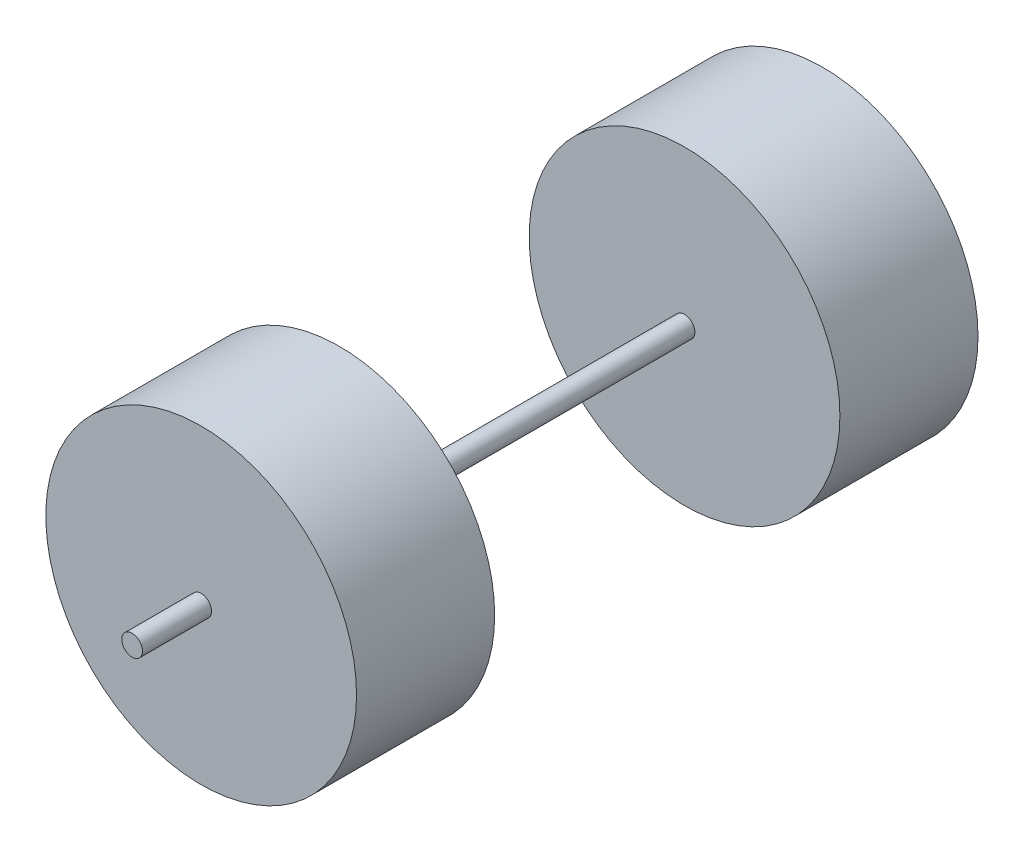
ISO-10303-21;
HEADER;
FILE_DESCRIPTION(('STEP AP214'),'2;1');
FILE_NAME('part.step','',(''),(''),'','','');
FILE_SCHEMA(('AUTOMOTIVE_DESIGN { 1 0 10303 214 1 1 1 1 }'));
ENDSEC;
DATA;
#1=APPLICATION_CONTEXT('core data for automotive mechanical design processes');
#2=APPLICATION_PROTOCOL_DEFINITION('international standard','automotive_design',2000,#1);
#3=PRODUCT_CONTEXT('',#1,'mechanical');
#4=PRODUCT('Part','Part','',(#3));
#5=PRODUCT_RELATED_PRODUCT_CATEGORY('part','',(#4));
#6=PRODUCT_DEFINITION_FORMATION('','',#4);
#7=PRODUCT_DEFINITION_CONTEXT('part definition',#1,'design');
#8=PRODUCT_DEFINITION('design','',#6,#7);
#9=PRODUCT_DEFINITION_SHAPE('','',#8);
#10=(LENGTH_UNIT() NAMED_UNIT(*) SI_UNIT(.MILLI.,.METRE.));
#11=(NAMED_UNIT(*) PLANE_ANGLE_UNIT() SI_UNIT($,.RADIAN.));
#12=(NAMED_UNIT(*) SI_UNIT($,.STERADIAN.) SOLID_ANGLE_UNIT());
#13=UNCERTAINTY_MEASURE_WITH_UNIT(LENGTH_MEASURE(1.E-05),#10,'distance_accuracy_value','');
#14=(GEOMETRIC_REPRESENTATION_CONTEXT(3) GLOBAL_UNCERTAINTY_ASSIGNED_CONTEXT((#13)) GLOBAL_UNIT_ASSIGNED_CONTEXT((#10,
#11,#12)) REPRESENTATION_CONTEXT('',''));
#15=CARTESIAN_POINT('',(0.,0.,0.));
#16=DIRECTION('',(0.,0.,1.));
#17=DIRECTION('',(1.,0.,0.));
#18=AXIS2_PLACEMENT_3D('',#15,#16,#17);
#19=CARTESIAN_POINT('',(0.,0.,0.));
#20=DIRECTION('',(0.,0.,1.));
#21=DIRECTION('',(1.,0.,0.));
#22=AXIS2_PLACEMENT_3D('',#19,#20,#21);
#23=PLANE('',#22);
#24=CARTESIAN_POINT('',(0.,0.,0.));
#25=DIRECTION('',(0.,0.,1.));
#26=DIRECTION('',(1.,0.,0.));
#27=AXIS2_PLACEMENT_3D('',#24,#25,#26);
#28=CIRCLE('',#27,22.5);
#29=CARTESIAN_POINT('',(22.5,0.,0.));
#30=VERTEX_POINT('',#29);
#31=EDGE_CURVE('E42',#30,#30,#28,.T.);
#32=ORIENTED_EDGE('',*,*,#31,.F.);
#33=EDGE_LOOP('',(#32));
#34=FACE_BOUND('',#33,.T.);
#35=CARTESIAN_POINT('',(0.,0.,0.));
#36=DIRECTION('',(0.,0.,1.));
#37=DIRECTION('',(1.,0.,0.));
#38=AXIS2_PLACEMENT_3D('',#35,#36,#37);
#39=CIRCLE('',#38,1.5);
#40=CARTESIAN_POINT('',(1.5,0.,0.));
#41=VERTEX_POINT('',#40);
#42=EDGE_CURVE('E10',#41,#41,#39,.F.);
#43=ORIENTED_EDGE('',*,*,#42,.F.);
#44=EDGE_LOOP('',(#43));
#45=FACE_BOUND('',#44,.T.);
#46=ADVANCED_FACE('F31',(#34,#45),#23,.F.);
#47=CARTESIAN_POINT('',(0.,0.,90.));
#48=DIRECTION('',(0.,0.,1.));
#49=DIRECTION('',(1.,0.,0.));
#50=AXIS2_PLACEMENT_3D('',#47,#48,#49);
#51=PLANE('',#50);
#52=CARTESIAN_POINT('',(0.,0.,90.));
#53=DIRECTION('',(0.,0.,1.));
#54=DIRECTION('',(1.,0.,0.));
#55=AXIS2_PLACEMENT_3D('',#52,#53,#54);
#56=CIRCLE('',#55,22.5);
#57=CARTESIAN_POINT('',(22.5,0.,90.));
#58=VERTEX_POINT('',#57);
#59=EDGE_CURVE('E52',#58,#58,#56,.T.);
#60=ORIENTED_EDGE('',*,*,#59,.T.);
#61=EDGE_LOOP('',(#60));
#62=FACE_BOUND('',#61,.T.);
#63=CARTESIAN_POINT('',(0.,0.,90.));
#64=DIRECTION('',(0.,0.,1.));
#65=DIRECTION('',(1.,0.,0.));
#66=AXIS2_PLACEMENT_3D('',#63,#64,#65);
#67=CIRCLE('',#66,1.5);
#68=CARTESIAN_POINT('',(1.5,0.,90.));
#69=VERTEX_POINT('',#68);
#70=EDGE_CURVE('E61',#69,#69,#67,.T.);
#71=ORIENTED_EDGE('',*,*,#70,.F.);
#72=EDGE_LOOP('',(#71));
#73=FACE_BOUND('',#72,.T.);
#74=ADVANCED_FACE('F85',(#62,#73),#51,.T.);
#75=CARTESIAN_POINT('',(0.,0.,20.));
#76=DIRECTION('',(0.,0.,1.));
#77=DIRECTION('',(1.,0.,0.));
#78=AXIS2_PLACEMENT_3D('',#75,#76,#77);
#79=PLANE('',#78);
#80=CARTESIAN_POINT('',(0.,0.,20.));
#81=DIRECTION('',(0.,0.,1.));
#82=DIRECTION('',(1.,0.,0.));
#83=AXIS2_PLACEMENT_3D('',#80,#81,#82);
#84=CIRCLE('',#83,22.5);
#85=CARTESIAN_POINT('',(22.5,0.,20.));
#86=VERTEX_POINT('',#85);
#87=EDGE_CURVE('E38',#86,#86,#84,.T.);
#88=ORIENTED_EDGE('',*,*,#87,.T.);
#89=EDGE_LOOP('',(#88));
#90=FACE_BOUND('',#89,.T.);
#91=CARTESIAN_POINT('',(0.,0.,20.));
#92=DIRECTION('',(0.,0.,1.));
#93=DIRECTION('',(1.,0.,0.));
#94=AXIS2_PLACEMENT_3D('',#91,#92,#93);
#95=CIRCLE('',#94,1.5);
#96=CARTESIAN_POINT('',(1.5,0.,20.));
#97=VERTEX_POINT('',#96);
#98=EDGE_CURVE('E49',#97,#97,#95,.T.);
#99=ORIENTED_EDGE('',*,*,#98,.F.);
#100=EDGE_LOOP('',(#99));
#101=FACE_BOUND('',#100,.T.);
#102=ADVANCED_FACE('F90',(#90,#101),#79,.T.);
#103=CARTESIAN_POINT('',(0.,0.,20.));
#104=DIRECTION('',(0.,0.,-1.));
#105=DIRECTION('',(-1.,0.,0.));
#106=AXIS2_PLACEMENT_3D('',#103,#104,#105);
#107=CYLINDRICAL_SURFACE('',#106,22.5);
#108=ORIENTED_EDGE('',*,*,#87,.F.);
#109=EDGE_LOOP('',(#108));
#110=FACE_BOUND('',#109,.T.);
#111=ORIENTED_EDGE('',*,*,#31,.T.);
#112=EDGE_LOOP('',(#111));
#113=FACE_BOUND('',#112,.T.);
#114=ADVANCED_FACE('F33',(#110,#113),#107,.T.);
#115=CARTESIAN_POINT('',(0.,0.,70.));
#116=DIRECTION('',(0.,0.,-1.));
#117=DIRECTION('',(-1.,0.,0.));
#118=AXIS2_PLACEMENT_3D('',#115,#116,#117);
#119=CYLINDRICAL_SURFACE('',#118,1.5);
#120=CARTESIAN_POINT('',(0.,0.,70.));
#121=DIRECTION('',(0.,0.,1.));
#122=DIRECTION('',(1.,0.,0.));
#123=AXIS2_PLACEMENT_3D('',#120,#121,#122);
#124=CIRCLE('',#123,1.5);
#125=CARTESIAN_POINT('',(1.5,0.,70.));
#126=VERTEX_POINT('',#125);
#127=EDGE_CURVE('E47',#126,#126,#124,.T.);
#128=ORIENTED_EDGE('',*,*,#127,.F.);
#129=EDGE_LOOP('',(#128));
#130=FACE_BOUND('',#129,.T.);
#131=ORIENTED_EDGE('',*,*,#98,.T.);
#132=EDGE_LOOP('',(#131));
#133=FACE_BOUND('',#132,.T.);
#134=ADVANCED_FACE('F98',(#130,#133),#119,.T.);
#135=CARTESIAN_POINT('',(0.,0.,70.));
#136=DIRECTION('',(0.,0.,1.));
#137=DIRECTION('',(1.,0.,0.));
#138=AXIS2_PLACEMENT_3D('',#135,#136,#137);
#139=PLANE('',#138);
#140=CARTESIAN_POINT('',(0.,0.,70.));
#141=DIRECTION('',(0.,0.,1.));
#142=DIRECTION('',(1.,0.,0.));
#143=AXIS2_PLACEMENT_3D('',#140,#141,#142);
#144=CIRCLE('',#143,22.5);
#145=CARTESIAN_POINT('',(22.5,0.,70.));
#146=VERTEX_POINT('',#145);
#147=EDGE_CURVE('E55',#146,#146,#144,.T.);
#148=ORIENTED_EDGE('',*,*,#147,.F.);
#149=EDGE_LOOP('',(#148));
#150=FACE_BOUND('',#149,.T.);
#151=ORIENTED_EDGE('',*,*,#127,.T.);
#152=EDGE_LOOP('',(#151));
#153=FACE_BOUND('',#152,.T.);
#154=ADVANCED_FACE('F101',(#150,#153),#139,.F.);
#155=CARTESIAN_POINT('',(0.,0.,90.));
#156=DIRECTION('',(0.,0.,-1.));
#157=DIRECTION('',(-1.,0.,0.));
#158=AXIS2_PLACEMENT_3D('',#155,#156,#157);
#159=CYLINDRICAL_SURFACE('',#158,22.5);
#160=ORIENTED_EDGE('',*,*,#59,.F.);
#161=EDGE_LOOP('',(#160));
#162=FACE_BOUND('',#161,.T.);
#163=ORIENTED_EDGE('',*,*,#147,.T.);
#164=EDGE_LOOP('',(#163));
#165=FACE_BOUND('',#164,.T.);
#166=ADVANCED_FACE('F103',(#162,#165),#159,.T.);
#167=CARTESIAN_POINT('',(0.,0.,100.));
#168=DIRECTION('',(0.,0.,-1.));
#169=DIRECTION('',(-1.,0.,0.));
#170=AXIS2_PLACEMENT_3D('',#167,#168,#169);
#171=CYLINDRICAL_SURFACE('',#170,1.5);
#172=CARTESIAN_POINT('',(0.,0.,100.));
#173=DIRECTION('',(0.,0.,1.));
#174=DIRECTION('',(1.,0.,0.));
#175=AXIS2_PLACEMENT_3D('',#172,#173,#174);
#176=CIRCLE('',#175,1.5);
#177=CARTESIAN_POINT('',(1.5,0.,100.));
#178=VERTEX_POINT('',#177);
#179=EDGE_CURVE('E58',#178,#178,#176,.T.);
#180=ORIENTED_EDGE('',*,*,#179,.F.);
#181=EDGE_LOOP('',(#180));
#182=FACE_BOUND('',#181,.T.);
#183=ORIENTED_EDGE('',*,*,#70,.T.);
#184=EDGE_LOOP('',(#183));
#185=FACE_BOUND('',#184,.T.);
#186=ADVANCED_FACE('F81',(#182,#185),#171,.T.);
#187=CARTESIAN_POINT('',(0.,0.,100.));
#188=DIRECTION('',(0.,0.,1.));
#189=DIRECTION('',(1.,0.,0.));
#190=AXIS2_PLACEMENT_3D('',#187,#188,#189);
#191=PLANE('',#190);
#192=ORIENTED_EDGE('',*,*,#179,.T.);
#193=EDGE_LOOP('',(#192));
#194=FACE_BOUND('',#193,.T.);
#195=ADVANCED_FACE('F74',(#194),#191,.T.);
#196=CARTESIAN_POINT('',(0.,0.,-10.));
#197=DIRECTION('',(0.,0.,1.));
#198=DIRECTION('',(1.,0.,0.));
#199=AXIS2_PLACEMENT_3D('',#196,#197,#198);
#200=CYLINDRICAL_SURFACE('',#199,1.5);
#201=CARTESIAN_POINT('',(0.,0.,-10.));
#202=DIRECTION('',(0.,0.,-1.));
#203=DIRECTION('',(-1.,0.,0.));
#204=AXIS2_PLACEMENT_3D('',#201,#202,#203);
#205=CIRCLE('',#204,1.5);
#206=CARTESIAN_POINT('',(-1.5,0.,-10.));
#207=VERTEX_POINT('',#206);
#208=EDGE_CURVE('E64',#207,#207,#205,.T.);
#209=ORIENTED_EDGE('',*,*,#208,.F.);
#210=EDGE_LOOP('',(#209));
#211=FACE_BOUND('',#210,.T.);
#212=ORIENTED_EDGE('',*,*,#42,.T.);
#213=EDGE_LOOP('',(#212));
#214=FACE_BOUND('',#213,.T.);
#215=ADVANCED_FACE('F72',(#211,#214),#200,.T.);
#216=CARTESIAN_POINT('',(0.,0.,-10.));
#217=DIRECTION('',(0.,0.,-1.));
#218=DIRECTION('',(-1.,0.,0.));
#219=AXIS2_PLACEMENT_3D('',#216,#217,#218);
#220=PLANE('',#219);
#221=ORIENTED_EDGE('',*,*,#208,.T.);
#222=EDGE_LOOP('',(#221));
#223=FACE_BOUND('',#222,.T.);
#224=ADVANCED_FACE('F70',(#223),#220,.T.);
#225=CLOSED_SHELL('',(#46,#74,#102,#114,#134,#154,#166,#186,#195,#215,#224));
#226=MANIFOLD_SOLID_BREP('B2',#225);
#227=ADVANCED_BREP_SHAPE_REPRESENTATION('',(#18,#226),#14);
#228=SHAPE_DEFINITION_REPRESENTATION(#9,#227);
ENDSEC;
END-ISO-10303-21;
